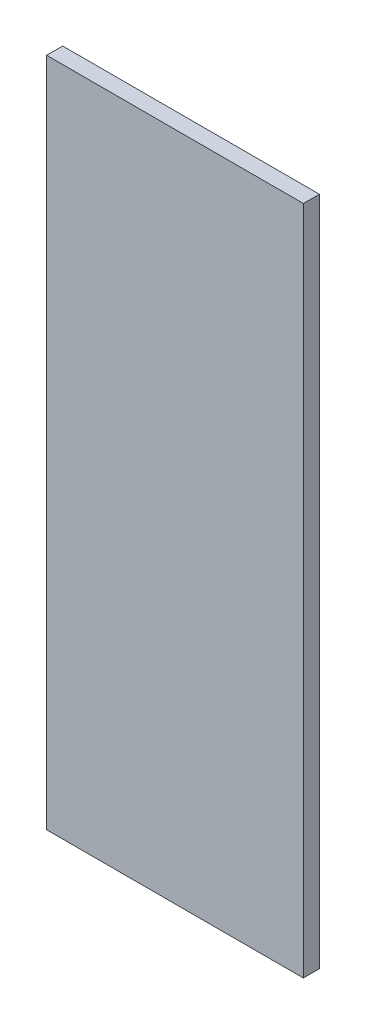
ISO-10303-21;
HEADER;
FILE_DESCRIPTION(('STEP AP214'),'2;1');
FILE_NAME('part.step','',(''),(''),'','','');
FILE_SCHEMA(('AUTOMOTIVE_DESIGN { 1 0 10303 214 1 1 1 1 }'));
ENDSEC;
DATA;
#1=APPLICATION_CONTEXT('core data for automotive mechanical design processes');
#2=APPLICATION_PROTOCOL_DEFINITION('international standard','automotive_design',2000,#1);
#3=PRODUCT_CONTEXT('',#1,'mechanical');
#4=PRODUCT('Part','Part','',(#3));
#5=PRODUCT_RELATED_PRODUCT_CATEGORY('part','',(#4));
#6=PRODUCT_DEFINITION_FORMATION('','',#4);
#7=PRODUCT_DEFINITION_CONTEXT('part definition',#1,'design');
#8=PRODUCT_DEFINITION('design','',#6,#7);
#9=PRODUCT_DEFINITION_SHAPE('','',#8);
#10=(LENGTH_UNIT() NAMED_UNIT(*) SI_UNIT(.MILLI.,.METRE.));
#11=(NAMED_UNIT(*) PLANE_ANGLE_UNIT() SI_UNIT($,.RADIAN.));
#12=(NAMED_UNIT(*) SI_UNIT($,.STERADIAN.) SOLID_ANGLE_UNIT());
#13=UNCERTAINTY_MEASURE_WITH_UNIT(LENGTH_MEASURE(1.E-05),#10,'distance_accuracy_value','');
#14=(GEOMETRIC_REPRESENTATION_CONTEXT(3) GLOBAL_UNCERTAINTY_ASSIGNED_CONTEXT((#13)) GLOBAL_UNIT_ASSIGNED_CONTEXT((#10,
#11,#12)) REPRESENTATION_CONTEXT('',''));
#15=CARTESIAN_POINT('',(0.,0.,0.));
#16=DIRECTION('',(0.,0.,1.));
#17=DIRECTION('',(1.,0.,0.));
#18=AXIS2_PLACEMENT_3D('',#15,#16,#17);
#19=CARTESIAN_POINT('',(0.,0.,50.));
#20=DIRECTION('',(-1.,0.,0.));
#21=DIRECTION('',(0.,0.,1.));
#22=AXIS2_PLACEMENT_3D('',#19,#20,#21);
#23=PLANE('',#22);
#24=DIRECTION('',(0.,1.,0.));
#25=VECTOR('',#24,1.);
#26=CARTESIAN_POINT('',(0.,0.,0.));
#27=LINE('',#26,#25);
#28=CARTESIAN_POINT('',(0.,0.,0.));
#29=VERTEX_POINT('',#28);
#30=CARTESIAN_POINT('',(0.,2090.,0.));
#31=VERTEX_POINT('',#30);
#32=EDGE_CURVE('E98',#29,#31,#27,.T.);
#33=ORIENTED_EDGE('',*,*,#32,.T.);
#34=DIRECTION('',(0.,0.,-1.));
#35=VECTOR('',#34,1.);
#36=CARTESIAN_POINT('',(0.,2090.,50.));
#37=LINE('',#36,#35);
#38=CARTESIAN_POINT('',(0.,2090.,50.));
#39=VERTEX_POINT('',#38);
#40=EDGE_CURVE('E11',#39,#31,#37,.T.);
#41=ORIENTED_EDGE('',*,*,#40,.F.);
#42=DIRECTION('',(0.,1.,0.));
#43=VECTOR('',#42,1.);
#44=CARTESIAN_POINT('',(0.,0.,50.));
#45=LINE('',#44,#43);
#46=CARTESIAN_POINT('',(0.,0.,50.));
#47=VERTEX_POINT('',#46);
#48=EDGE_CURVE('E86',#47,#39,#45,.T.);
#49=ORIENTED_EDGE('',*,*,#48,.F.);
#50=DIRECTION('',(0.,0.,-1.));
#51=VECTOR('',#50,1.);
#52=CARTESIAN_POINT('',(0.,0.,50.));
#53=LINE('',#52,#51);
#54=EDGE_CURVE('E94',#47,#29,#53,.T.);
#55=ORIENTED_EDGE('',*,*,#54,.T.);
#56=EDGE_LOOP('',(#33,#41,#49,#55));
#57=FACE_BOUND('',#56,.T.);
#58=ADVANCED_FACE('F35',(#57),#23,.F.);
#59=CARTESIAN_POINT('',(0.,2090.,50.));
#60=DIRECTION('',(0.,-1.,0.));
#61=DIRECTION('',(0.,0.,-1.));
#62=AXIS2_PLACEMENT_3D('',#59,#60,#61);
#63=PLANE('',#62);
#64=DIRECTION('',(-1.,0.,0.));
#65=VECTOR('',#64,1.);
#66=CARTESIAN_POINT('',(0.,2090.,0.));
#67=LINE('',#66,#65);
#68=CARTESIAN_POINT('',(-800.,2090.,0.));
#69=VERTEX_POINT('',#68);
#70=EDGE_CURVE('E90',#31,#69,#67,.T.);
#71=ORIENTED_EDGE('',*,*,#70,.T.);
#72=DIRECTION('',(0.,0.,-1.));
#73=VECTOR('',#72,1.);
#74=CARTESIAN_POINT('',(-800.,2090.,50.));
#75=LINE('',#74,#73);
#76=CARTESIAN_POINT('',(-800.,2090.,50.));
#77=VERTEX_POINT('',#76);
#78=EDGE_CURVE('E43',#77,#69,#75,.T.);
#79=ORIENTED_EDGE('',*,*,#78,.F.);
#80=DIRECTION('',(-1.,0.,0.));
#81=VECTOR('',#80,1.);
#82=CARTESIAN_POINT('',(0.,2090.,50.));
#83=LINE('',#82,#81);
#84=EDGE_CURVE('E81',#39,#77,#83,.T.);
#85=ORIENTED_EDGE('',*,*,#84,.F.);
#86=ORIENTED_EDGE('',*,*,#40,.T.);
#87=EDGE_LOOP('',(#71,#79,#85,#86));
#88=FACE_BOUND('',#87,.T.);
#89=ADVANCED_FACE('F89',(#88),#63,.F.);
#90=CARTESIAN_POINT('',(-800.,-1.10218211923262E-13,50.));
#91=DIRECTION('',(1.,0.,0.));
#92=DIRECTION('',(0.,1.,0.));
#93=AXIS2_PLACEMENT_3D('',#90,#91,#92);
#94=PLANE('',#93);
#95=DIRECTION('',(0.,-1.,0.));
#96=VECTOR('',#95,1.);
#97=CARTESIAN_POINT('',(-800.,-1.10218211923262E-13,0.));
#98=LINE('',#97,#96);
#99=CARTESIAN_POINT('',(-800.,-1.10218211923262E-13,0.));
#100=VERTEX_POINT('',#99);
#101=EDGE_CURVE('E68',#69,#100,#98,.T.);
#102=ORIENTED_EDGE('',*,*,#101,.T.);
#103=DIRECTION('',(0.,0.,-1.));
#104=VECTOR('',#103,1.);
#105=CARTESIAN_POINT('',(-800.,-1.10218211923262E-13,50.));
#106=LINE('',#105,#104);
#107=CARTESIAN_POINT('',(-800.,-1.10218211923262E-13,50.));
#108=VERTEX_POINT('',#107);
#109=EDGE_CURVE('E91',#108,#100,#106,.T.);
#110=ORIENTED_EDGE('',*,*,#109,.F.);
#111=DIRECTION('',(0.,-1.,0.));
#112=VECTOR('',#111,1.);
#113=CARTESIAN_POINT('',(-800.,-1.10218211923262E-13,50.));
#114=LINE('',#113,#112);
#115=EDGE_CURVE('E84',#77,#108,#114,.T.);
#116=ORIENTED_EDGE('',*,*,#115,.F.);
#117=ORIENTED_EDGE('',*,*,#78,.T.);
#118=EDGE_LOOP('',(#102,#110,#116,#117));
#119=FACE_BOUND('',#118,.T.);
#120=ADVANCED_FACE('F92',(#119),#94,.F.);
#121=CARTESIAN_POINT('',(0.,0.,50.));
#122=DIRECTION('',(0.,1.,0.));
#123=DIRECTION('',(-1.,0.,0.));
#124=AXIS2_PLACEMENT_3D('',#121,#122,#123);
#125=PLANE('',#124);
#126=DIRECTION('',(1.,0.,0.));
#127=VECTOR('',#126,1.);
#128=CARTESIAN_POINT('',(0.,0.,0.));
#129=LINE('',#128,#127);
#130=EDGE_CURVE('E74',#100,#29,#129,.T.);
#131=ORIENTED_EDGE('',*,*,#130,.T.);
#132=ORIENTED_EDGE('',*,*,#54,.F.);
#133=DIRECTION('',(1.,0.,0.));
#134=VECTOR('',#133,1.);
#135=CARTESIAN_POINT('',(0.,0.,50.));
#136=LINE('',#135,#134);
#137=EDGE_CURVE('E51',#108,#47,#136,.T.);
#138=ORIENTED_EDGE('',*,*,#137,.F.);
#139=ORIENTED_EDGE('',*,*,#109,.T.);
#140=EDGE_LOOP('',(#131,#132,#138,#139));
#141=FACE_BOUND('',#140,.T.);
#142=ADVANCED_FACE('F105',(#141),#125,.F.);
#143=CARTESIAN_POINT('',(0.,0.,50.));
#144=DIRECTION('',(0.,0.,1.));
#145=DIRECTION('',(1.,0.,0.));
#146=AXIS2_PLACEMENT_3D('',#143,#144,#145);
#147=PLANE('',#146);
#148=ORIENTED_EDGE('',*,*,#48,.T.);
#149=ORIENTED_EDGE('',*,*,#84,.T.);
#150=ORIENTED_EDGE('',*,*,#115,.T.);
#151=ORIENTED_EDGE('',*,*,#137,.T.);
#152=EDGE_LOOP('',(#148,#149,#150,#151));
#153=FACE_BOUND('',#152,.T.);
#154=ADVANCED_FACE('F82',(#153),#147,.T.);
#155=CARTESIAN_POINT('',(0.,0.,0.));
#156=DIRECTION('',(0.,0.,1.));
#157=DIRECTION('',(1.,0.,0.));
#158=AXIS2_PLACEMENT_3D('',#155,#156,#157);
#159=PLANE('',#158);
#160=ORIENTED_EDGE('',*,*,#32,.F.);
#161=ORIENTED_EDGE('',*,*,#130,.F.);
#162=ORIENTED_EDGE('',*,*,#101,.F.);
#163=ORIENTED_EDGE('',*,*,#70,.F.);
#164=EDGE_LOOP('',(#160,#161,#162,#163));
#165=FACE_BOUND('',#164,.T.);
#166=ADVANCED_FACE('F108',(#165),#159,.F.);
#167=CLOSED_SHELL('',(#58,#89,#120,#142,#154,#166));
#168=MANIFOLD_SOLID_BREP('B2',#167);
#169=ADVANCED_BREP_SHAPE_REPRESENTATION('',(#18,#168),#14);
#170=SHAPE_DEFINITION_REPRESENTATION(#9,#169);
ENDSEC;
END-ISO-10303-21;
